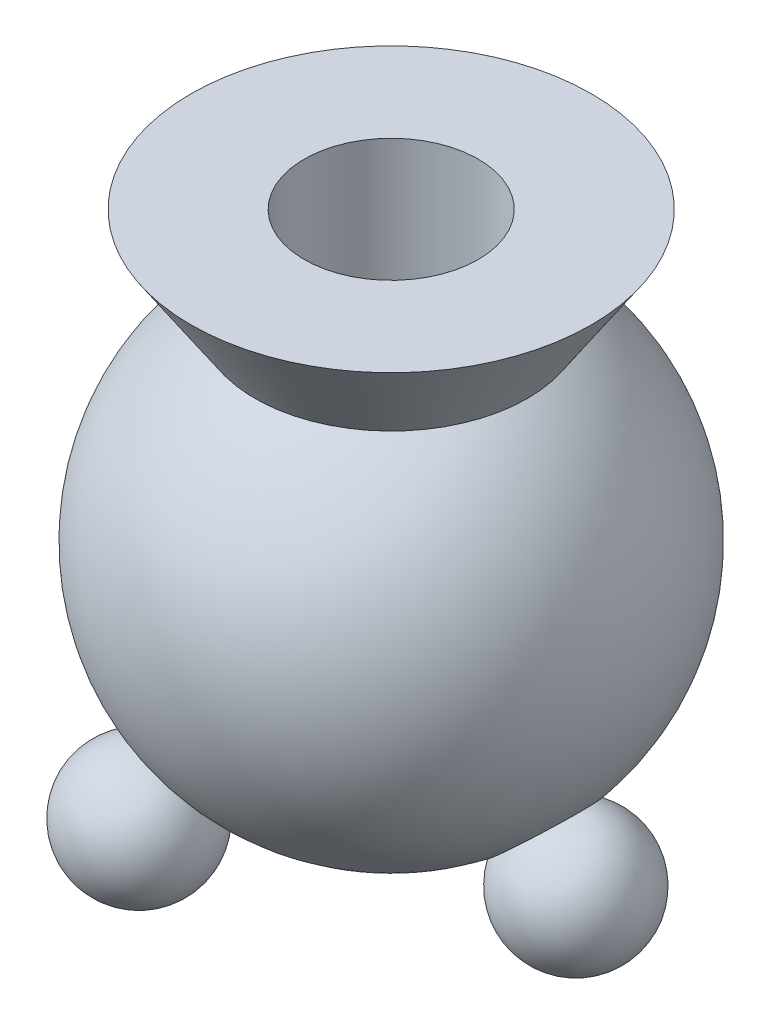
ISO-10303-21;
HEADER;
FILE_DESCRIPTION(('STEP AP214'),'2;1');
FILE_NAME('part.step','',(''),(''),'','','');
FILE_SCHEMA(('AUTOMOTIVE_DESIGN { 1 0 10303 214 1 1 1 1 }'));
ENDSEC;
DATA;
#1=APPLICATION_CONTEXT('core data for automotive mechanical design processes');
#2=APPLICATION_PROTOCOL_DEFINITION('international standard','automotive_design',2000,#1);
#3=PRODUCT_CONTEXT('',#1,'mechanical');
#4=PRODUCT('Part','Part','',(#3));
#5=PRODUCT_RELATED_PRODUCT_CATEGORY('part','',(#4));
#6=PRODUCT_DEFINITION_FORMATION('','',#4);
#7=PRODUCT_DEFINITION_CONTEXT('part definition',#1,'design');
#8=PRODUCT_DEFINITION('design','',#6,#7);
#9=PRODUCT_DEFINITION_SHAPE('','',#8);
#10=(LENGTH_UNIT() NAMED_UNIT(*) SI_UNIT(.MILLI.,.METRE.));
#11=(NAMED_UNIT(*) PLANE_ANGLE_UNIT() SI_UNIT($,.RADIAN.));
#12=(NAMED_UNIT(*) SI_UNIT($,.STERADIAN.) SOLID_ANGLE_UNIT());
#13=UNCERTAINTY_MEASURE_WITH_UNIT(LENGTH_MEASURE(1.E-05),#10,'distance_accuracy_value','');
#14=(GEOMETRIC_REPRESENTATION_CONTEXT(3) GLOBAL_UNCERTAINTY_ASSIGNED_CONTEXT((#13)) GLOBAL_UNIT_ASSIGNED_CONTEXT((#10,
#11,#12)) REPRESENTATION_CONTEXT('',''));
#15=CARTESIAN_POINT('',(0.,0.,0.));
#16=DIRECTION('',(0.,0.,1.));
#17=DIRECTION('',(1.,0.,0.));
#18=AXIS2_PLACEMENT_3D('',#15,#16,#17);
#19=CARTESIAN_POINT('',(0.,27.,0.));
#20=DIRECTION('',(0.,-1.,0.));
#21=DIRECTION('',(1.,0.,0.));
#22=AXIS2_PLACEMENT_3D('',#19,#20,#21);
#23=SPHERICAL_SURFACE('',#22,27.);
#24=CARTESIAN_POINT('',(-8.82769007361315,7.26391334835179,15.2900077209693));
#25=DIRECTION('',(-0.33336362269953,-0.745301804802986,0.577402731910801));
#26=DIRECTION('',(0.,-0.612435037521136,-0.790520919910716));
#27=AXIS2_PLACEMENT_3D('',#24,#25,#26);
#28=CIRCLE('',#27,5.27014568447264);
#29=CARTESIAN_POINT('',(-8.82769007361315,4.03629147833993,11.1238473064165));
#30=VERTEX_POINT('',#29);
#31=EDGE_CURVE('E50',#30,#30,#28,.F.);
#32=ORIENTED_EDGE('',*,*,#31,.T.);
#33=EDGE_LOOP('',(#32));
#34=FACE_BOUND('',#33,.T.);
#35=CARTESIAN_POINT('',(0.,49.,0.));
#36=DIRECTION('',(0.,-1.,0.));
#37=DIRECTION('',(1.,0.,0.));
#38=AXIS2_PLACEMENT_3D('',#35,#36,#37);
#39=CIRCLE('',#38,15.6524758424985);
#40=CARTESIAN_POINT('',(15.6524758424985,49.,0.));
#41=VERTEX_POINT('',#40);
#42=EDGE_CURVE('E49',#41,#41,#39,.T.);
#43=ORIENTED_EDGE('',*,*,#42,.T.);
#44=EDGE_LOOP('',(#43));
#45=FACE_BOUND('',#44,.T.);
#46=CARTESIAN_POINT('',(17.6553801472262,7.26391334835178,0.));
#47=DIRECTION('',(0.666727245399055,-0.745301804802986,0.));
#48=DIRECTION('',(0.745301804802986,0.666727245399055,0.));
#49=AXIS2_PLACEMENT_3D('',#46,#47,#48);
#50=CIRCLE('',#49,5.27014568447264);
#51=CARTESIAN_POINT('',(21.5832292374383,10.7776630634119,0.));
#52=VERTEX_POINT('',#51);
#53=EDGE_CURVE('E47',#52,#52,#50,.F.);
#54=ORIENTED_EDGE('',*,*,#53,.T.);
#55=EDGE_LOOP('',(#54));
#56=FACE_BOUND('',#55,.T.);
#57=CARTESIAN_POINT('',(-8.82769007361293,7.26391334835179,-15.2900077209694));
#58=DIRECTION('',(-0.333363622699522,-0.745301804802986,-0.577402731910806));
#59=DIRECTION('',(0.,0.612435037521139,-0.790520919910714));
#60=AXIS2_PLACEMENT_3D('',#57,#58,#59);
#61=CIRCLE('',#60,5.27014568447264);
#62=CARTESIAN_POINT('',(-8.82769007361293,10.4915352183637,-19.4561681355222));
#63=VERTEX_POINT('',#62);
#64=EDGE_CURVE('E34',#63,#63,#61,.F.);
#65=ORIENTED_EDGE('',*,*,#64,.T.);
#66=EDGE_LOOP('',(#65));
#67=FACE_BOUND('',#66,.T.);
#68=ADVANCED_FACE('F31',(#34,#45,#56,#67),#23,.T.);
#69=CARTESIAN_POINT('',(0.,40.,0.));
#70=DIRECTION('',(0.,1.,0.));
#71=DIRECTION('',(-1.,0.,0.));
#72=AXIS2_PLACEMENT_3D('',#69,#70,#71);
#73=PLANE('',#72);
#74=CARTESIAN_POINT('',(0.,40.,0.));
#75=DIRECTION('',(0.,-1.,0.));
#76=DIRECTION('',(1.,0.,0.));
#77=AXIS2_PLACEMENT_3D('',#74,#75,#76);
#78=CIRCLE('',#77,10.);
#79=CARTESIAN_POINT('',(10.,40.,0.));
#80=VERTEX_POINT('',#79);
#81=EDGE_CURVE('E10',#80,#80,#78,.T.);
#82=ORIENTED_EDGE('',*,*,#81,.F.);
#83=EDGE_LOOP('',(#82));
#84=FACE_BOUND('',#83,.T.);
#85=ADVANCED_FACE('F69',(#84),#73,.T.);
#86=CARTESIAN_POINT('',(0.,0.,0.));
#87=DIRECTION('',(0.,-1.,0.));
#88=DIRECTION('',(1.,0.,0.));
#89=AXIS2_PLACEMENT_3D('',#86,#87,#88);
#90=CYLINDRICAL_SURFACE('',#89,10.);
#91=ORIENTED_EDGE('',*,*,#81,.T.);
#92=EDGE_LOOP('',(#91));
#93=FACE_BOUND('',#92,.T.);
#94=CARTESIAN_POINT('',(0.,60.,0.));
#95=DIRECTION('',(0.,-1.,0.));
#96=DIRECTION('',(1.,0.,0.));
#97=AXIS2_PLACEMENT_3D('',#94,#95,#96);
#98=CIRCLE('',#97,10.);
#99=CARTESIAN_POINT('',(10.,60.,0.));
#100=VERTEX_POINT('',#99);
#101=EDGE_CURVE('E38',#100,#100,#98,.T.);
#102=ORIENTED_EDGE('',*,*,#101,.F.);
#103=EDGE_LOOP('',(#102));
#104=FACE_BOUND('',#103,.T.);
#105=ADVANCED_FACE('F73',(#93,#104),#90,.F.);
#106=CARTESIAN_POINT('',(10.,60.,0.));
#107=DIRECTION('',(0.,1.,0.));
#108=DIRECTION('',(-1.,0.,0.));
#109=AXIS2_PLACEMENT_3D('',#106,#107,#108);
#110=PLANE('',#109);
#111=ORIENTED_EDGE('',*,*,#101,.T.);
#112=EDGE_LOOP('',(#111));
#113=FACE_BOUND('',#112,.T.);
#114=CARTESIAN_POINT('',(0.,60.,0.));
#115=DIRECTION('',(0.,-1.,0.));
#116=DIRECTION('',(1.,0.,0.));
#117=AXIS2_PLACEMENT_3D('',#114,#115,#116);
#118=CIRCLE('',#117,23.);
#119=CARTESIAN_POINT('',(23.,60.,0.));
#120=VERTEX_POINT('',#119);
#121=EDGE_CURVE('E43',#120,#120,#118,.T.);
#122=ORIENTED_EDGE('',*,*,#121,.F.);
#123=EDGE_LOOP('',(#122));
#124=FACE_BOUND('',#123,.T.);
#125=ADVANCED_FACE('F87',(#113,#124),#110,.T.);
#126=CARTESIAN_POINT('',(0.,49.,0.));
#127=DIRECTION('',(0.,1.,0.));
#128=DIRECTION('',(-1.,0.,0.));
#129=AXIS2_PLACEMENT_3D('',#126,#127,#128);
#130=CONICAL_SURFACE('',#129,15.6524758424985,0.588895200634732);
#131=ORIENTED_EDGE('',*,*,#121,.T.);
#132=EDGE_LOOP('',(#131));
#133=FACE_BOUND('',#132,.T.);
#134=ORIENTED_EDGE('',*,*,#42,.F.);
#135=EDGE_LOOP('',(#134));
#136=FACE_BOUND('',#135,.T.);
#137=ADVANCED_FACE('F82',(#133,#136),#130,.T.);
#138=CARTESIAN_POINT('',(21.2132034355963,3.28679656440322,0.));
#139=DIRECTION('',(-0.707106781186544,0.707106781186551,0.));
#140=DIRECTION('',(0.707106781186551,0.707106781186544,0.));
#141=AXIS2_PLACEMENT_3D('',#138,#139,#140);
#142=SPHERICAL_SURFACE('',#141,7.5);
#143=CARTESIAN_POINT('',(21.2132034355963,3.28679656440322,0.));
#144=DIRECTION('',(0.666727245399055,-0.745301804802986,0.));
#145=DIRECTION('',(0.745301804802986,0.666727245399055,0.));
#146=AXIS2_PLACEMENT_3D('',#143,#144,#145);
#147=SPHERICAL_SURFACE('',#146,7.5);
#148=ORIENTED_EDGE('',*,*,#53,.F.);
#149=EDGE_LOOP('',(#148));
#150=FACE_BOUND('',#149,.T.);
#151=ADVANCED_FACE('F65',(#150),#147,.T.);
#152=CARTESIAN_POINT('',(-10.6066017177982,3.28679656440322,18.3711730708737));
#153=DIRECTION('',(0.353553390593275,0.707106781186551,-0.61237243569579));
#154=DIRECTION('',(-0.353553390593278,0.707106781186544,0.612372435695796));
#155=AXIS2_PLACEMENT_3D('',#152,#153,#154);
#156=SPHERICAL_SURFACE('',#155,7.5);
#157=CARTESIAN_POINT('',(-10.6066017177982,3.28679656440322,18.3711730708737));
#158=DIRECTION('',(-0.33336362269953,-0.745301804802986,0.577402731910801));
#159=DIRECTION('',(0.,-0.612435037521136,-0.790520919910716));
#160=AXIS2_PLACEMENT_3D('',#157,#158,#159);
#161=SPHERICAL_SURFACE('',#160,7.5);
#162=ORIENTED_EDGE('',*,*,#31,.F.);
#163=EDGE_LOOP('',(#162));
#164=FACE_BOUND('',#163,.T.);
#165=ADVANCED_FACE('F60',(#164),#161,.T.);
#166=CARTESIAN_POINT('',(-10.606601717798,3.28679656440322,-18.3711730708738));
#167=DIRECTION('',(0.353553390593266,0.707106781186551,0.612372435695795));
#168=DIRECTION('',(-0.35355339059327,0.707106781186544,-0.612372435695801));
#169=AXIS2_PLACEMENT_3D('',#166,#167,#168);
#170=SPHERICAL_SURFACE('',#169,7.5);
#171=CARTESIAN_POINT('',(-10.606601717798,3.28679656440322,-18.3711730708738));
#172=DIRECTION('',(-0.333363622699522,-0.745301804802986,-0.577402731910806));
#173=DIRECTION('',(0.,0.612435037521139,-0.790520919910714));
#174=AXIS2_PLACEMENT_3D('',#171,#172,#173);
#175=SPHERICAL_SURFACE('',#174,7.5);
#176=ORIENTED_EDGE('',*,*,#64,.F.);
#177=EDGE_LOOP('',(#176));
#178=FACE_BOUND('',#177,.T.);
#179=ADVANCED_FACE('F58',(#178),#175,.T.);
#180=CLOSED_SHELL('',(#68,#85,#105,#125,#137,#151,#165,#179));
#181=MANIFOLD_SOLID_BREP('B2',#180);
#182=ADVANCED_BREP_SHAPE_REPRESENTATION('',(#18,#181),#14);
#183=SHAPE_DEFINITION_REPRESENTATION(#9,#182);
ENDSEC;
END-ISO-10303-21;
